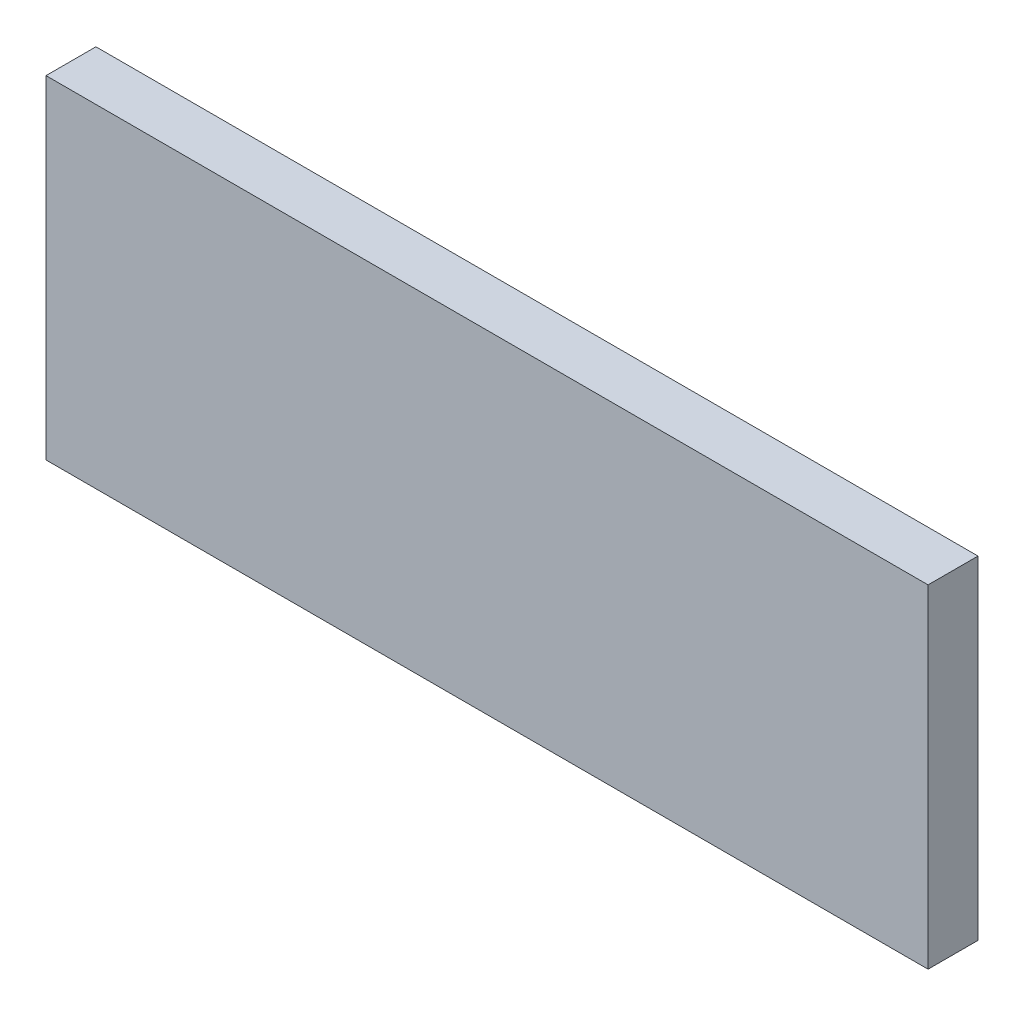
ISO-10303-21;
HEADER;
FILE_DESCRIPTION(('STEP AP214'),'2;1');
FILE_NAME('part.step','',(''),(''),'','','');
FILE_SCHEMA(('AUTOMOTIVE_DESIGN { 1 0 10303 214 1 1 1 1 }'));
ENDSEC;
DATA;
#1=APPLICATION_CONTEXT('core data for automotive mechanical design processes');
#2=APPLICATION_PROTOCOL_DEFINITION('international standard','automotive_design',2000,#1);
#3=PRODUCT_CONTEXT('',#1,'mechanical');
#4=PRODUCT('Part','Part','',(#3));
#5=PRODUCT_RELATED_PRODUCT_CATEGORY('part','',(#4));
#6=PRODUCT_DEFINITION_FORMATION('','',#4);
#7=PRODUCT_DEFINITION_CONTEXT('part definition',#1,'design');
#8=PRODUCT_DEFINITION('design','',#6,#7);
#9=PRODUCT_DEFINITION_SHAPE('','',#8);
#10=(LENGTH_UNIT() NAMED_UNIT(*) SI_UNIT(.MILLI.,.METRE.));
#11=(NAMED_UNIT(*) PLANE_ANGLE_UNIT() SI_UNIT($,.RADIAN.));
#12=(NAMED_UNIT(*) SI_UNIT($,.STERADIAN.) SOLID_ANGLE_UNIT());
#13=UNCERTAINTY_MEASURE_WITH_UNIT(LENGTH_MEASURE(1.E-05),#10,'distance_accuracy_value','');
#14=(GEOMETRIC_REPRESENTATION_CONTEXT(3) GLOBAL_UNCERTAINTY_ASSIGNED_CONTEXT((#13)) GLOBAL_UNIT_ASSIGNED_CONTEXT((#10,
#11,#12)) REPRESENTATION_CONTEXT('',''));
#15=CARTESIAN_POINT('',(0.,0.,0.));
#16=DIRECTION('',(0.,0.,1.));
#17=DIRECTION('',(1.,0.,0.));
#18=AXIS2_PLACEMENT_3D('',#15,#16,#17);
#19=CARTESIAN_POINT('',(132.5,-49.9999999999999,15.));
#20=DIRECTION('',(-1.,0.,0.));
#21=DIRECTION('',(0.,0.,1.));
#22=AXIS2_PLACEMENT_3D('',#19,#20,#21);
#23=PLANE('',#22);
#24=DIRECTION('',(0.,1.,0.));
#25=VECTOR('',#24,1.);
#26=CARTESIAN_POINT('',(132.5,-49.9999999999999,0.));
#27=LINE('',#26,#25);
#28=CARTESIAN_POINT('',(132.5,-49.9999999999999,0.));
#29=VERTEX_POINT('',#28);
#30=CARTESIAN_POINT('',(132.5,50.,0.));
#31=VERTEX_POINT('',#30);
#32=EDGE_CURVE('E96',#29,#31,#27,.T.);
#33=ORIENTED_EDGE('',*,*,#32,.T.);
#34=DIRECTION('',(0.,0.,-1.));
#35=VECTOR('',#34,1.);
#36=CARTESIAN_POINT('',(132.5,50.,15.));
#37=LINE('',#36,#35);
#38=CARTESIAN_POINT('',(132.5,50.,15.));
#39=VERTEX_POINT('',#38);
#40=EDGE_CURVE('E11',#39,#31,#37,.T.);
#41=ORIENTED_EDGE('',*,*,#40,.F.);
#42=DIRECTION('',(0.,1.,0.));
#43=VECTOR('',#42,1.);
#44=CARTESIAN_POINT('',(132.5,-49.9999999999999,15.));
#45=LINE('',#44,#43);
#46=CARTESIAN_POINT('',(132.5,-49.9999999999999,15.));
#47=VERTEX_POINT('',#46);
#48=EDGE_CURVE('E84',#47,#39,#45,.T.);
#49=ORIENTED_EDGE('',*,*,#48,.F.);
#50=DIRECTION('',(0.,0.,-1.));
#51=VECTOR('',#50,1.);
#52=CARTESIAN_POINT('',(132.5,-49.9999999999999,15.));
#53=LINE('',#52,#51);
#54=EDGE_CURVE('E92',#47,#29,#53,.T.);
#55=ORIENTED_EDGE('',*,*,#54,.T.);
#56=EDGE_LOOP('',(#33,#41,#49,#55));
#57=FACE_BOUND('',#56,.T.);
#58=ADVANCED_FACE('F33',(#57),#23,.F.);
#59=CARTESIAN_POINT('',(-132.5,50.,15.));
#60=DIRECTION('',(0.,-1.,0.));
#61=DIRECTION('',(0.,0.,-1.));
#62=AXIS2_PLACEMENT_3D('',#59,#60,#61);
#63=PLANE('',#62);
#64=DIRECTION('',(-1.,0.,0.));
#65=VECTOR('',#64,1.);
#66=CARTESIAN_POINT('',(-132.5,50.,0.));
#67=LINE('',#66,#65);
#68=CARTESIAN_POINT('',(-132.5,50.,0.));
#69=VERTEX_POINT('',#68);
#70=EDGE_CURVE('E88',#31,#69,#67,.T.);
#71=ORIENTED_EDGE('',*,*,#70,.T.);
#72=DIRECTION('',(0.,0.,-1.));
#73=VECTOR('',#72,1.);
#74=CARTESIAN_POINT('',(-132.5,50.,15.));
#75=LINE('',#74,#73);
#76=CARTESIAN_POINT('',(-132.5,50.,15.));
#77=VERTEX_POINT('',#76);
#78=EDGE_CURVE('E41',#77,#69,#75,.T.);
#79=ORIENTED_EDGE('',*,*,#78,.F.);
#80=DIRECTION('',(-1.,0.,0.));
#81=VECTOR('',#80,1.);
#82=CARTESIAN_POINT('',(-132.5,50.,15.));
#83=LINE('',#82,#81);
#84=EDGE_CURVE('E79',#39,#77,#83,.T.);
#85=ORIENTED_EDGE('',*,*,#84,.F.);
#86=ORIENTED_EDGE('',*,*,#40,.T.);
#87=EDGE_LOOP('',(#71,#79,#85,#86));
#88=FACE_BOUND('',#87,.T.);
#89=ADVANCED_FACE('F87',(#88),#63,.F.);
#90=CARTESIAN_POINT('',(-132.5,-49.9999999999999,15.));
#91=DIRECTION('',(1.,0.,0.));
#92=DIRECTION('',(0.,0.,-1.));
#93=AXIS2_PLACEMENT_3D('',#90,#91,#92);
#94=PLANE('',#93);
#95=DIRECTION('',(0.,-1.,0.));
#96=VECTOR('',#95,1.);
#97=CARTESIAN_POINT('',(-132.5,-49.9999999999999,0.));
#98=LINE('',#97,#96);
#99=CARTESIAN_POINT('',(-132.5,-49.9999999999999,0.));
#100=VERTEX_POINT('',#99);
#101=EDGE_CURVE('E66',#69,#100,#98,.T.);
#102=ORIENTED_EDGE('',*,*,#101,.T.);
#103=DIRECTION('',(0.,0.,-1.));
#104=VECTOR('',#103,1.);
#105=CARTESIAN_POINT('',(-132.5,-49.9999999999999,15.));
#106=LINE('',#105,#104);
#107=CARTESIAN_POINT('',(-132.5,-49.9999999999999,15.));
#108=VERTEX_POINT('',#107);
#109=EDGE_CURVE('E89',#108,#100,#106,.T.);
#110=ORIENTED_EDGE('',*,*,#109,.F.);
#111=DIRECTION('',(0.,-1.,0.));
#112=VECTOR('',#111,1.);
#113=CARTESIAN_POINT('',(-132.5,-49.9999999999999,15.));
#114=LINE('',#113,#112);
#115=EDGE_CURVE('E82',#77,#108,#114,.T.);
#116=ORIENTED_EDGE('',*,*,#115,.F.);
#117=ORIENTED_EDGE('',*,*,#78,.T.);
#118=EDGE_LOOP('',(#102,#110,#116,#117));
#119=FACE_BOUND('',#118,.T.);
#120=ADVANCED_FACE('F90',(#119),#94,.F.);
#121=CARTESIAN_POINT('',(-132.5,-49.9999999999999,15.));
#122=DIRECTION('',(0.,1.,0.));
#123=DIRECTION('',(0.,0.,1.));
#124=AXIS2_PLACEMENT_3D('',#121,#122,#123);
#125=PLANE('',#124);
#126=DIRECTION('',(1.,0.,0.));
#127=VECTOR('',#126,1.);
#128=CARTESIAN_POINT('',(-132.5,-49.9999999999999,0.));
#129=LINE('',#128,#127);
#130=EDGE_CURVE('E72',#100,#29,#129,.T.);
#131=ORIENTED_EDGE('',*,*,#130,.T.);
#132=ORIENTED_EDGE('',*,*,#54,.F.);
#133=DIRECTION('',(1.,0.,0.));
#134=VECTOR('',#133,1.);
#135=CARTESIAN_POINT('',(-132.5,-49.9999999999999,15.));
#136=LINE('',#135,#134);
#137=EDGE_CURVE('E49',#108,#47,#136,.T.);
#138=ORIENTED_EDGE('',*,*,#137,.F.);
#139=ORIENTED_EDGE('',*,*,#109,.T.);
#140=EDGE_LOOP('',(#131,#132,#138,#139));
#141=FACE_BOUND('',#140,.T.);
#142=ADVANCED_FACE('F103',(#141),#125,.F.);
#143=CARTESIAN_POINT('',(0.,0.,15.));
#144=DIRECTION('',(0.,0.,-1.));
#145=DIRECTION('',(-1.,0.,0.));
#146=AXIS2_PLACEMENT_3D('',#143,#144,#145);
#147=PLANE('',#146);
#148=ORIENTED_EDGE('',*,*,#48,.T.);
#149=ORIENTED_EDGE('',*,*,#84,.T.);
#150=ORIENTED_EDGE('',*,*,#115,.T.);
#151=ORIENTED_EDGE('',*,*,#137,.T.);
#152=EDGE_LOOP('',(#148,#149,#150,#151));
#153=FACE_BOUND('',#152,.T.);
#154=ADVANCED_FACE('F80',(#153),#147,.F.);
#155=CARTESIAN_POINT('',(0.,0.,0.));
#156=DIRECTION('',(0.,0.,-1.));
#157=DIRECTION('',(-1.,0.,0.));
#158=AXIS2_PLACEMENT_3D('',#155,#156,#157);
#159=PLANE('',#158);
#160=ORIENTED_EDGE('',*,*,#32,.F.);
#161=ORIENTED_EDGE('',*,*,#130,.F.);
#162=ORIENTED_EDGE('',*,*,#101,.F.);
#163=ORIENTED_EDGE('',*,*,#70,.F.);
#164=EDGE_LOOP('',(#160,#161,#162,#163));
#165=FACE_BOUND('',#164,.T.);
#166=ADVANCED_FACE('F106',(#165),#159,.T.);
#167=CLOSED_SHELL('',(#58,#89,#120,#142,#154,#166));
#168=MANIFOLD_SOLID_BREP('B2',#167);
#169=ADVANCED_BREP_SHAPE_REPRESENTATION('',(#18,#168),#14);
#170=SHAPE_DEFINITION_REPRESENTATION(#9,#169);
ENDSEC;
END-ISO-10303-21;
